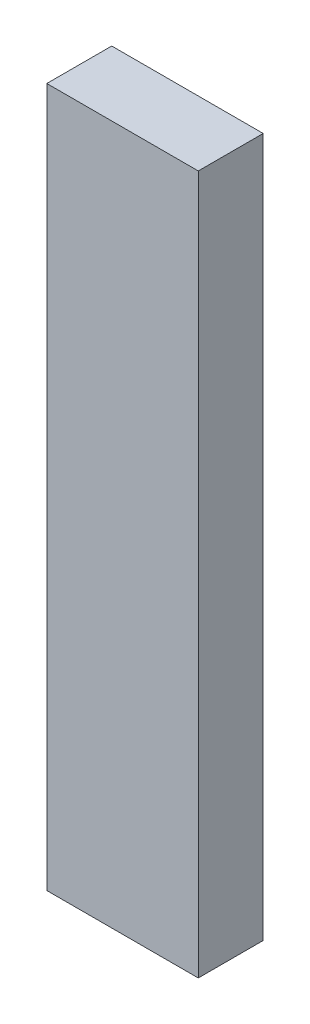
ISO-10303-21;
HEADER;
FILE_DESCRIPTION(('STEP AP214'),'2;1');
FILE_NAME('part.step','',(''),(''),'','','');
FILE_SCHEMA(('AUTOMOTIVE_DESIGN { 1 0 10303 214 1 1 1 1 }'));
ENDSEC;
DATA;
#1=APPLICATION_CONTEXT('core data for automotive mechanical design processes');
#2=APPLICATION_PROTOCOL_DEFINITION('international standard','automotive_design',2000,#1);
#3=PRODUCT_CONTEXT('',#1,'mechanical');
#4=PRODUCT('Part','Part','',(#3));
#5=PRODUCT_RELATED_PRODUCT_CATEGORY('part','',(#4));
#6=PRODUCT_DEFINITION_FORMATION('','',#4);
#7=PRODUCT_DEFINITION_CONTEXT('part definition',#1,'design');
#8=PRODUCT_DEFINITION('design','',#6,#7);
#9=PRODUCT_DEFINITION_SHAPE('','',#8);
#10=(LENGTH_UNIT() NAMED_UNIT(*) SI_UNIT(.MILLI.,.METRE.));
#11=(NAMED_UNIT(*) PLANE_ANGLE_UNIT() SI_UNIT($,.RADIAN.));
#12=(NAMED_UNIT(*) SI_UNIT($,.STERADIAN.) SOLID_ANGLE_UNIT());
#13=UNCERTAINTY_MEASURE_WITH_UNIT(LENGTH_MEASURE(1.E-05),#10,'distance_accuracy_value','');
#14=(GEOMETRIC_REPRESENTATION_CONTEXT(3) GLOBAL_UNCERTAINTY_ASSIGNED_CONTEXT((#13)) GLOBAL_UNIT_ASSIGNED_CONTEXT((#10,
#11,#12)) REPRESENTATION_CONTEXT('',''));
#15=CARTESIAN_POINT('',(0.,0.,0.));
#16=DIRECTION('',(0.,0.,1.));
#17=DIRECTION('',(1.,0.,0.));
#18=AXIS2_PLACEMENT_3D('',#15,#16,#17);
#19=CARTESIAN_POINT('',(3.5,16.15,3.));
#20=DIRECTION('',(-1.,0.,0.));
#21=DIRECTION('',(0.,-1.,0.));
#22=AXIS2_PLACEMENT_3D('',#19,#20,#21);
#23=PLANE('',#22);
#24=DIRECTION('',(0.,1.,0.));
#25=VECTOR('',#24,1.);
#26=CARTESIAN_POINT('',(3.5,16.15,0.));
#27=LINE('',#26,#25);
#28=CARTESIAN_POINT('',(3.5,-16.15,0.));
#29=VERTEX_POINT('',#28);
#30=CARTESIAN_POINT('',(3.5,16.15,0.));
#31=VERTEX_POINT('',#30);
#32=EDGE_CURVE('E107',#29,#31,#27,.T.);
#33=ORIENTED_EDGE('',*,*,#32,.T.);
#34=DIRECTION('',(0.,0.,-1.));
#35=VECTOR('',#34,1.);
#36=CARTESIAN_POINT('',(3.5,16.15,3.));
#37=LINE('',#36,#35);
#38=CARTESIAN_POINT('',(3.5,16.15,3.));
#39=VERTEX_POINT('',#38);
#40=EDGE_CURVE('E11',#39,#31,#37,.T.);
#41=ORIENTED_EDGE('',*,*,#40,.F.);
#42=DIRECTION('',(0.,1.,0.));
#43=VECTOR('',#42,1.);
#44=CARTESIAN_POINT('',(3.5,16.15,3.));
#45=LINE('',#44,#43);
#46=CARTESIAN_POINT('',(3.5,-16.15,3.));
#47=VERTEX_POINT('',#46);
#48=EDGE_CURVE('E91',#47,#39,#45,.T.);
#49=ORIENTED_EDGE('',*,*,#48,.F.);
#50=DIRECTION('',(0.,0.,-1.));
#51=VECTOR('',#50,1.);
#52=CARTESIAN_POINT('',(3.5,-16.15,3.));
#53=LINE('',#52,#51);
#54=EDGE_CURVE('E103',#47,#29,#53,.T.);
#55=ORIENTED_EDGE('',*,*,#54,.T.);
#56=EDGE_LOOP('',(#33,#41,#49,#55));
#57=FACE_BOUND('',#56,.T.);
#58=ADVANCED_FACE('F39',(#57),#23,.F.);
#59=CARTESIAN_POINT('',(-3.5,16.15,3.));
#60=DIRECTION('',(0.,-1.,0.));
#61=DIRECTION('',(0.,0.,-1.));
#62=AXIS2_PLACEMENT_3D('',#59,#60,#61);
#63=PLANE('',#62);
#64=DIRECTION('',(-1.,0.,0.));
#65=VECTOR('',#64,1.);
#66=CARTESIAN_POINT('',(-3.5,16.15,0.));
#67=LINE('',#66,#65);
#68=CARTESIAN_POINT('',(-3.5,16.15,0.));
#69=VERTEX_POINT('',#68);
#70=EDGE_CURVE('E96',#31,#69,#67,.T.);
#71=ORIENTED_EDGE('',*,*,#70,.T.);
#72=DIRECTION('',(0.,0.,-1.));
#73=VECTOR('',#72,1.);
#74=CARTESIAN_POINT('',(-3.5,16.15,3.));
#75=LINE('',#74,#73);
#76=CARTESIAN_POINT('',(-3.5,16.15,3.));
#77=VERTEX_POINT('',#76);
#78=EDGE_CURVE('E48',#77,#69,#75,.T.);
#79=ORIENTED_EDGE('',*,*,#78,.F.);
#80=DIRECTION('',(-1.,0.,0.));
#81=VECTOR('',#80,1.);
#82=CARTESIAN_POINT('',(-3.5,16.15,3.));
#83=LINE('',#82,#81);
#84=EDGE_CURVE('E86',#39,#77,#83,.T.);
#85=ORIENTED_EDGE('',*,*,#84,.F.);
#86=ORIENTED_EDGE('',*,*,#40,.T.);
#87=EDGE_LOOP('',(#71,#79,#85,#86));
#88=FACE_BOUND('',#87,.T.);
#89=ADVANCED_FACE('F95',(#88),#63,.F.);
#90=CARTESIAN_POINT('',(-3.5,16.15,3.));
#91=DIRECTION('',(1.,0.,0.));
#92=DIRECTION('',(0.,1.,0.));
#93=AXIS2_PLACEMENT_3D('',#90,#91,#92);
#94=PLANE('',#93);
#95=DIRECTION('',(0.,-1.,0.));
#96=VECTOR('',#95,1.);
#97=CARTESIAN_POINT('',(-3.5,16.15,0.));
#98=LINE('',#97,#96);
#99=CARTESIAN_POINT('',(-3.5,-16.15,0.));
#100=VERTEX_POINT('',#99);
#101=EDGE_CURVE('E73',#69,#100,#98,.T.);
#102=ORIENTED_EDGE('',*,*,#101,.T.);
#103=DIRECTION('',(0.,0.,-1.));
#104=VECTOR('',#103,1.);
#105=CARTESIAN_POINT('',(-3.5,-16.15,3.));
#106=LINE('',#105,#104);
#107=CARTESIAN_POINT('',(-3.5,-16.15,3.));
#108=VERTEX_POINT('',#107);
#109=EDGE_CURVE('E98',#108,#100,#106,.T.);
#110=ORIENTED_EDGE('',*,*,#109,.F.);
#111=DIRECTION('',(0.,-1.,0.));
#112=VECTOR('',#111,1.);
#113=CARTESIAN_POINT('',(-3.5,16.15,3.));
#114=LINE('',#113,#112);
#115=EDGE_CURVE('E89',#77,#108,#114,.T.);
#116=ORIENTED_EDGE('',*,*,#115,.F.);
#117=ORIENTED_EDGE('',*,*,#78,.T.);
#118=EDGE_LOOP('',(#102,#110,#116,#117));
#119=FACE_BOUND('',#118,.T.);
#120=ADVANCED_FACE('F99',(#119),#94,.F.);
#121=CARTESIAN_POINT('',(-3.5,-16.15,3.));
#122=DIRECTION('',(0.,1.,0.));
#123=DIRECTION('',(0.,0.,1.));
#124=AXIS2_PLACEMENT_3D('',#121,#122,#123);
#125=PLANE('',#124);
#126=DIRECTION('',(1.,0.,0.));
#127=VECTOR('',#126,1.);
#128=CARTESIAN_POINT('',(-3.5,-16.15,0.));
#129=LINE('',#128,#127);
#130=EDGE_CURVE('E79',#100,#29,#129,.T.);
#131=ORIENTED_EDGE('',*,*,#130,.T.);
#132=ORIENTED_EDGE('',*,*,#54,.F.);
#133=DIRECTION('',(1.,0.,0.));
#134=VECTOR('',#133,1.);
#135=CARTESIAN_POINT('',(-3.5,-16.15,3.));
#136=LINE('',#135,#134);
#137=EDGE_CURVE('E56',#108,#47,#136,.T.);
#138=ORIENTED_EDGE('',*,*,#137,.F.);
#139=ORIENTED_EDGE('',*,*,#109,.T.);
#140=EDGE_LOOP('',(#131,#132,#138,#139));
#141=FACE_BOUND('',#140,.T.);
#142=ADVANCED_FACE('F120',(#141),#125,.F.);
#143=CARTESIAN_POINT('',(0.,0.,3.));
#144=DIRECTION('',(0.,0.,1.));
#145=DIRECTION('',(1.,0.,0.));
#146=AXIS2_PLACEMENT_3D('',#143,#144,#145);
#147=PLANE('',#146);
#148=ORIENTED_EDGE('',*,*,#48,.T.);
#149=ORIENTED_EDGE('',*,*,#84,.T.);
#150=ORIENTED_EDGE('',*,*,#115,.T.);
#151=ORIENTED_EDGE('',*,*,#137,.T.);
#152=EDGE_LOOP('',(#148,#149,#150,#151));
#153=FACE_BOUND('',#152,.T.);
#154=ADVANCED_FACE('F87',(#153),#147,.T.);
#155=CARTESIAN_POINT('',(0.,0.,0.));
#156=DIRECTION('',(0.,0.,1.));
#157=DIRECTION('',(1.,0.,0.));
#158=AXIS2_PLACEMENT_3D('',#155,#156,#157);
#159=PLANE('',#158);
#160=ORIENTED_EDGE('',*,*,#32,.F.);
#161=ORIENTED_EDGE('',*,*,#130,.F.);
#162=ORIENTED_EDGE('',*,*,#101,.F.);
#163=ORIENTED_EDGE('',*,*,#70,.F.);
#164=EDGE_LOOP('',(#160,#161,#162,#163));
#165=FACE_BOUND('',#164,.T.);
#166=ADVANCED_FACE('F123',(#165),#159,.F.);
#167=CLOSED_SHELL('',(#58,#89,#120,#142,#154,#166));
#168=MANIFOLD_SOLID_BREP('B2',#167);
#169=ADVANCED_BREP_SHAPE_REPRESENTATION('',(#18,#168),#14);
#170=SHAPE_DEFINITION_REPRESENTATION(#9,#169);
ENDSEC;
END-ISO-10303-21;
